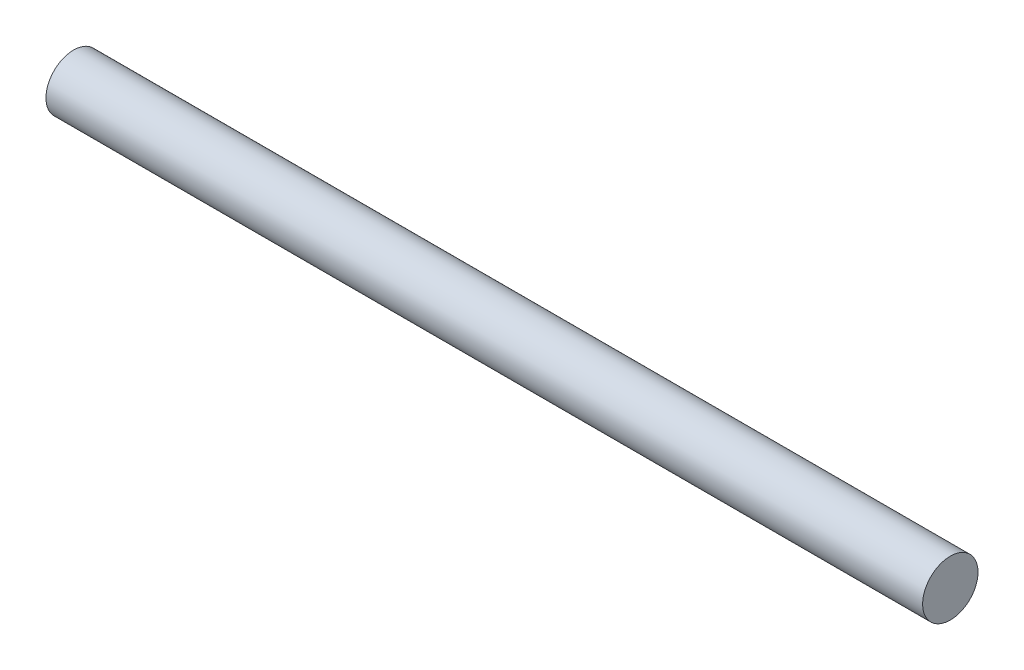
ISO-10303-21;
HEADER;
FILE_DESCRIPTION(('STEP AP214'),'2;1');
FILE_NAME('part.step','',(''),(''),'','','');
FILE_SCHEMA(('AUTOMOTIVE_DESIGN { 1 0 10303 214 1 1 1 1 }'));
ENDSEC;
DATA;
#1=APPLICATION_CONTEXT('core data for automotive mechanical design processes');
#2=APPLICATION_PROTOCOL_DEFINITION('international standard','automotive_design',2000,#1);
#3=PRODUCT_CONTEXT('',#1,'mechanical');
#4=PRODUCT('Part','Part','',(#3));
#5=PRODUCT_RELATED_PRODUCT_CATEGORY('part','',(#4));
#6=PRODUCT_DEFINITION_FORMATION('','',#4);
#7=PRODUCT_DEFINITION_CONTEXT('part definition',#1,'design');
#8=PRODUCT_DEFINITION('design','',#6,#7);
#9=PRODUCT_DEFINITION_SHAPE('','',#8);
#10=(LENGTH_UNIT() NAMED_UNIT(*) SI_UNIT(.MILLI.,.METRE.));
#11=(NAMED_UNIT(*) PLANE_ANGLE_UNIT() SI_UNIT($,.RADIAN.));
#12=(NAMED_UNIT(*) SI_UNIT($,.STERADIAN.) SOLID_ANGLE_UNIT());
#13=UNCERTAINTY_MEASURE_WITH_UNIT(LENGTH_MEASURE(1.E-05),#10,'distance_accuracy_value','');
#14=(GEOMETRIC_REPRESENTATION_CONTEXT(3) GLOBAL_UNCERTAINTY_ASSIGNED_CONTEXT((#13)) GLOBAL_UNIT_ASSIGNED_CONTEXT((#10,
#11,#12)) REPRESENTATION_CONTEXT('',''));
#15=CARTESIAN_POINT('',(0.,0.,0.));
#16=DIRECTION('',(0.,0.,1.));
#17=DIRECTION('',(1.,0.,0.));
#18=AXIS2_PLACEMENT_3D('',#15,#16,#17);
#19=CARTESIAN_POINT('',(-165.657180513353,0.,0.));
#20=DIRECTION('',(1.,0.,0.));
#21=DIRECTION('',(0.,0.,-1.));
#22=AXIS2_PLACEMENT_3D('',#19,#20,#21);
#23=CYLINDRICAL_SURFACE('',#22,50.);
#24=CARTESIAN_POINT('',(-165.657180513353,0.,0.));
#25=DIRECTION('',(1.,0.,0.));
#26=DIRECTION('',(0.,0.,-1.));
#27=AXIS2_PLACEMENT_3D('',#24,#25,#26);
#28=CIRCLE('',#27,50.);
#29=CARTESIAN_POINT('',(-165.657180513353,0.,-50.));
#30=VERTEX_POINT('',#29);
#31=EDGE_CURVE('E12',#30,#30,#28,.T.);
#32=CARTESIAN_POINT('',(1417.32895916992,0.,0.));
#33=DIRECTION('',(1.,0.,0.));
#34=DIRECTION('',(0.,0.,-1.));
#35=AXIS2_PLACEMENT_3D('',#32,#33,#34);
#36=CIRCLE('',#35,50.);
#37=CARTESIAN_POINT('',(1417.32895916992,0.,-50.));
#38=VERTEX_POINT('',#37);
#39=EDGE_CURVE('E49',#38,#38,#36,.T.);
#40=CARTESIAN_POINT('',(-165.657180513353,0.,-50.));
#41=CARTESIAN_POINT('',(-149.167741558319,0.,-50.));
#42=CARTESIAN_POINT('',(-132.678302603285,0.,-50.));
#43=CARTESIAN_POINT('',(-99.699424693217,0.,-50.));
#44=CARTESIAN_POINT('',(-83.2099857381829,0.,-50.));
#45=CARTESIAN_POINT('',(-50.2311078281147,0.,-50.));
#46=CARTESIAN_POINT('',(-33.7416688730806,0.,-50.));
#47=CARTESIAN_POINT('',(-0.762790963012339,0.,-50.));
#48=CARTESIAN_POINT('',(15.7266479920218,0.,-50.));
#49=CARTESIAN_POINT('',(48.70552590209,0.,-50.));
#50=CARTESIAN_POINT('',(65.1949648571241,0.,-50.));
#51=CARTESIAN_POINT('',(98.1738427671923,0.,-50.));
#52=CARTESIAN_POINT('',(114.663281722226,0.,-50.));
#53=CARTESIAN_POINT('',(147.642159632295,0.,-50.));
#54=CARTESIAN_POINT('',(164.131598587329,0.,-50.));
#55=CARTESIAN_POINT('',(197.110476497397,0.,-50.));
#56=CARTESIAN_POINT('',(213.599915452431,0.,-50.));
#57=CARTESIAN_POINT('',(246.578793362499,0.,-50.));
#58=CARTESIAN_POINT('',(263.068232317533,0.,-50.));
#59=CARTESIAN_POINT('',(296.047110227602,0.,-50.));
#60=CARTESIAN_POINT('',(312.536549182636,0.,-50.));
#61=CARTESIAN_POINT('',(345.515427092704,0.,-50.));
#62=CARTESIAN_POINT('',(362.004866047738,0.,-50.));
#63=CARTESIAN_POINT('',(394.983743957806,0.,-50.));
#64=CARTESIAN_POINT('',(411.47318291284,0.,-50.));
#65=CARTESIAN_POINT('',(444.452060822909,0.,-50.));
#66=CARTESIAN_POINT('',(460.941499777943,0.,-50.));
#67=CARTESIAN_POINT('',(493.920377688011,0.,-50.));
#68=CARTESIAN_POINT('',(510.409816643045,0.,-50.));
#69=CARTESIAN_POINT('',(543.388694553113,0.,-50.));
#70=CARTESIAN_POINT('',(559.878133508147,0.,-50.));
#71=CARTESIAN_POINT('',(592.857011418216,0.,-50.));
#72=CARTESIAN_POINT('',(609.34645037325,0.,-50.));
#73=CARTESIAN_POINT('',(642.325328283318,0.,-50.));
#74=CARTESIAN_POINT('',(658.814767238352,0.,-50.));
#75=CARTESIAN_POINT('',(691.79364514842,0.,-50.));
#76=CARTESIAN_POINT('',(708.283084103454,0.,-50.));
#77=CARTESIAN_POINT('',(741.261962013523,0.,-50.));
#78=CARTESIAN_POINT('',(757.751400968557,0.,-50.));
#79=CARTESIAN_POINT('',(790.730278878625,0.,-50.));
#80=CARTESIAN_POINT('',(807.219717833659,0.,-50.));
#81=CARTESIAN_POINT('',(840.198595743727,0.,-50.));
#82=CARTESIAN_POINT('',(856.688034698761,0.,-50.));
#83=CARTESIAN_POINT('',(889.666912608829,0.,-50.));
#84=CARTESIAN_POINT('',(906.156351563863,0.,-50.));
#85=CARTESIAN_POINT('',(939.135229473932,0.,-50.));
#86=CARTESIAN_POINT('',(955.624668428966,0.,-50.));
#87=CARTESIAN_POINT('',(988.603546339034,0.,-50.));
#88=CARTESIAN_POINT('',(1005.09298529407,0.,-50.));
#89=CARTESIAN_POINT('',(1038.07186320414,0.,-50.));
#90=CARTESIAN_POINT('',(1054.56130215917,0.,-50.));
#91=CARTESIAN_POINT('',(1087.54018006924,0.,-50.));
#92=CARTESIAN_POINT('',(1104.02961902427,0.,-50.));
#93=CARTESIAN_POINT('',(1137.00849693434,0.,-50.));
#94=CARTESIAN_POINT('',(1153.49793588938,0.,-50.));
#95=CARTESIAN_POINT('',(1186.47681379944,0.,-50.));
#96=CARTESIAN_POINT('',(1202.96625275448,0.,-50.));
#97=CARTESIAN_POINT('',(1235.94513066455,0.,-50.));
#98=CARTESIAN_POINT('',(1252.43456961958,0.,-50.));
#99=CARTESIAN_POINT('',(1285.41344752965,0.,-50.));
#100=CARTESIAN_POINT('',(1301.90288648468,0.,-50.));
#101=CARTESIAN_POINT('',(1334.88176439475,0.,-50.));
#102=CARTESIAN_POINT('',(1351.37120334978,0.,-50.));
#103=CARTESIAN_POINT('',(1384.35008125985,0.,-50.));
#104=CARTESIAN_POINT('',(1400.83952021489,0.,-50.));
#105=CARTESIAN_POINT('',(1417.32895916992,0.,-50.));
#106=B_SPLINE_CURVE_WITH_KNOTS('',3,(#40,#41,#42,#43,#44,#45,#46,#47,#48,#49,#50,#51,#52,#53,
#54,#55,#56,#57,#58,#59,#60,#61,#62,#63,#64,#65,#66,#67,#68,#69,#70,#71,#72,#73,#74,#75,#76,#77,
#78,#79,#80,#81,#82,#83,#84,#85,#86,#87,#88,#89,#90,#91,#92,#93,#94,#95,#96,#97,#98,#99,#100,
#101,#102,#103,#104,#105),.UNSPECIFIED.,.F.,.F.,(4,2,2,2,2,2,2,2,2,2,2,2,2,2,2,2,2,2,2,2,2,2,2,
2,2,2,2,2,2,2,2,2,4),(0.,49.4683168651023,98.9366337302046,148.404950595307,197.873267460409,
247.341584325512,296.809901190614,346.278218055716,395.746534920819,445.214851785921,
494.683168651023,544.151485516126,593.619802381228,643.08811924633,692.556436111433,
742.024752976535,791.493069841637,840.96138670674,890.429703571842,939.898020436944,
989.366337302047,1038.83465416715,1088.30297103225,1137.77128789735,1187.23960476246,
1236.70792162756,1286.17623849266,1335.64455535776,1385.11287222287,1434.58118908797,
1484.04950595307,1533.51782281817,1582.98613968327),.UNSPECIFIED.);
#107=EDGE_CURVE('BSEAM43',#30,#38,#106,.T.);
#108=ORIENTED_EDGE('',*,*,#31,.T.);
#109=ORIENTED_EDGE('',*,*,#39,.F.);
#110=ORIENTED_EDGE('',*,*,#107,.T.);
#111=ORIENTED_EDGE('',*,*,#107,.F.);
#112=EDGE_LOOP('',(#108,#110,#109,#111));
#113=FACE_BOUND('',#112,.T.);
#114=ADVANCED_FACE('F43',(#113),#23,.T.);
#115=CARTESIAN_POINT('',(-165.657180513353,0.,0.));
#116=DIRECTION('',(1.,0.,0.));
#117=DIRECTION('',(0.,0.,-1.));
#118=AXIS2_PLACEMENT_3D('',#115,#116,#117);
#119=PLANE('',#118);
#120=ORIENTED_EDGE('',*,*,#31,.F.);
#121=EDGE_LOOP('',(#120));
#122=FACE_BOUND('',#121,.T.);
#123=ADVANCED_FACE('F58',(#122),#119,.F.);
#124=CARTESIAN_POINT('',(1417.32895916992,0.,0.));
#125=DIRECTION('',(1.,0.,0.));
#126=DIRECTION('',(0.,0.,-1.));
#127=AXIS2_PLACEMENT_3D('',#124,#125,#126);
#128=PLANE('',#127);
#129=ORIENTED_EDGE('',*,*,#39,.T.);
#130=EDGE_LOOP('',(#129));
#131=FACE_BOUND('',#130,.T.);
#132=ADVANCED_FACE('F55',(#131),#128,.T.);
#133=CLOSED_SHELL('',(#114,#123,#132));
#134=MANIFOLD_SOLID_BREP('B2',#133);
#135=ADVANCED_BREP_SHAPE_REPRESENTATION('',(#18,#134),#14);
#136=SHAPE_DEFINITION_REPRESENTATION(#9,#135);
ENDSEC;
END-ISO-10303-21;
